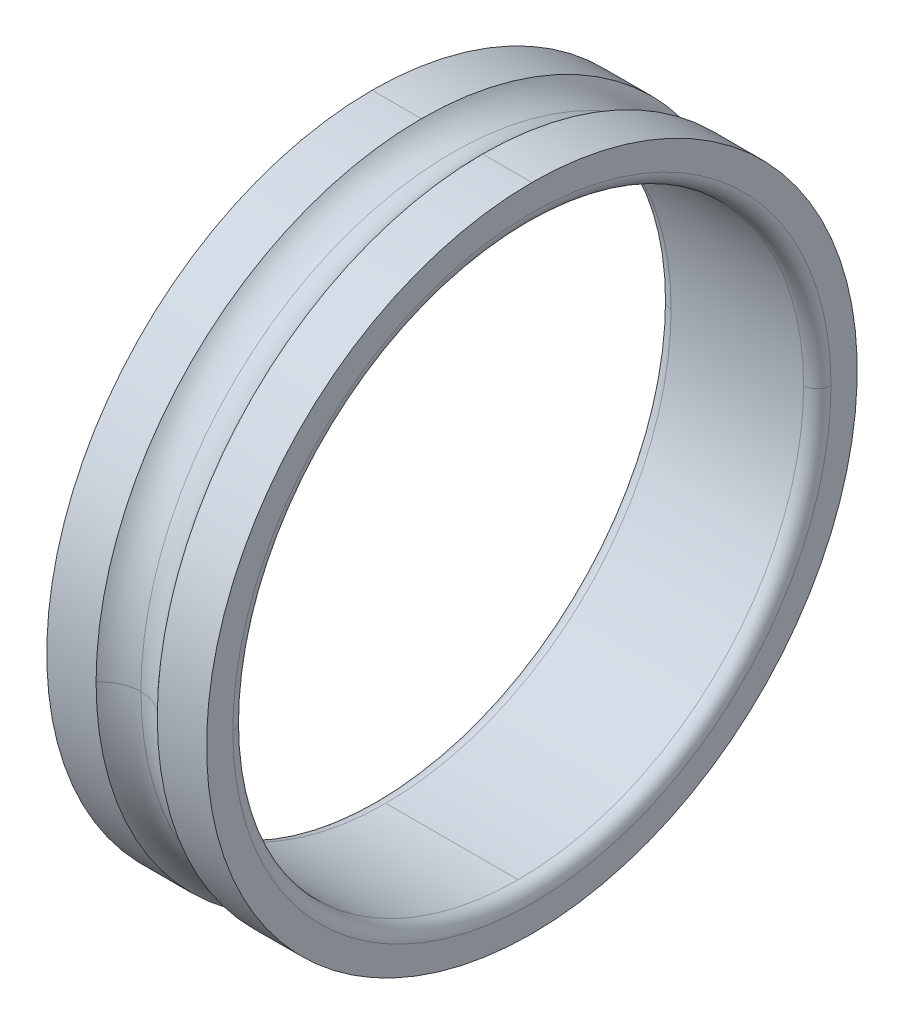
ISO-10303-21;
HEADER;
FILE_DESCRIPTION(('STEP AP214'),'2;1');
FILE_NAME('part.step','',(''),(''),'','','');
FILE_SCHEMA(('AUTOMOTIVE_DESIGN { 1 0 10303 214 1 1 1 1 }'));
ENDSEC;
DATA;
#1=APPLICATION_CONTEXT('core data for automotive mechanical design processes');
#2=APPLICATION_PROTOCOL_DEFINITION('international standard','automotive_design',2000,#1);
#3=PRODUCT_CONTEXT('',#1,'mechanical');
#4=PRODUCT('Part','Part','',(#3));
#5=PRODUCT_RELATED_PRODUCT_CATEGORY('part','',(#4));
#6=PRODUCT_DEFINITION_FORMATION('','',#4);
#7=PRODUCT_DEFINITION_CONTEXT('part definition',#1,'design');
#8=PRODUCT_DEFINITION('design','',#6,#7);
#9=PRODUCT_DEFINITION_SHAPE('','',#8);
#10=(LENGTH_UNIT() NAMED_UNIT(*) SI_UNIT(.MILLI.,.METRE.));
#11=(NAMED_UNIT(*) PLANE_ANGLE_UNIT() SI_UNIT($,.RADIAN.));
#12=(NAMED_UNIT(*) SI_UNIT($,.STERADIAN.) SOLID_ANGLE_UNIT());
#13=UNCERTAINTY_MEASURE_WITH_UNIT(LENGTH_MEASURE(1.E-05),#10,'distance_accuracy_value','');
#14=(GEOMETRIC_REPRESENTATION_CONTEXT(3) GLOBAL_UNCERTAINTY_ASSIGNED_CONTEXT((#13)) GLOBAL_UNIT_ASSIGNED_CONTEXT((#10,
#11,#12)) REPRESENTATION_CONTEXT('',''));
#15=CARTESIAN_POINT('',(0.,0.,0.));
#16=DIRECTION('',(0.,0.,1.));
#17=DIRECTION('',(1.,0.,0.));
#18=AXIS2_PLACEMENT_3D('',#15,#16,#17);
#19=CARTESIAN_POINT('',(5.92023783092273,0.,0.));
#20=DIRECTION('',(1.,0.,0.));
#21=DIRECTION('',(0.,1.,0.));
#22=AXIS2_PLACEMENT_3D('',#19,#20,#21);
#23=CYLINDRICAL_SURFACE('',#22,14.25);
#24=DIRECTION('',(1.,0.,0.));
#25=VECTOR('',#24,1.);
#26=CARTESIAN_POINT('',(5.92023783092273,14.25,0.));
#27=LINE('',#26,#25);
#28=CARTESIAN_POINT('',(4.84047566184545,14.25,0.));
#29=VERTEX_POINT('',#28);
#30=CARTESIAN_POINT('',(7.,14.25,0.));
#31=VERTEX_POINT('',#30);
#32=EDGE_CURVE('E155',#29,#31,#27,.T.);
#33=ORIENTED_EDGE('',*,*,#32,.T.);
#34=CARTESIAN_POINT('',(7.,0.,0.));
#35=DIRECTION('',(1.,0.,0.));
#36=DIRECTION('',(0.,1.,0.));
#37=AXIS2_PLACEMENT_3D('',#34,#35,#36);
#38=CIRCLE('',#37,14.25);
#39=CARTESIAN_POINT('',(7.,-14.25,0.));
#40=VERTEX_POINT('',#39);
#41=EDGE_CURVE('E214',#40,#31,#38,.T.);
#42=ORIENTED_EDGE('',*,*,#41,.F.);
#43=DIRECTION('',(-1.,0.,0.));
#44=VECTOR('',#43,1.);
#45=CARTESIAN_POINT('',(5.92023783092273,-14.25,0.));
#46=LINE('',#45,#44);
#47=CARTESIAN_POINT('',(4.84047566184545,-14.25,0.));
#48=VERTEX_POINT('',#47);
#49=EDGE_CURVE('E161',#40,#48,#46,.T.);
#50=ORIENTED_EDGE('',*,*,#49,.T.);
#51=CARTESIAN_POINT('',(4.84047566184545,0.,0.));
#52=DIRECTION('',(1.,0.,0.));
#53=DIRECTION('',(0.,1.,0.));
#54=AXIS2_PLACEMENT_3D('',#51,#52,#53);
#55=CIRCLE('',#54,14.25);
#56=CARTESIAN_POINT('',(4.84047566184545,0.,-14.25));
#57=VERTEX_POINT('',#56);
#58=EDGE_CURVE('E146',#48,#57,#55,.T.);
#59=ORIENTED_EDGE('',*,*,#58,.T.);
#60=CARTESIAN_POINT('',(4.84047566184545,0.,0.));
#61=DIRECTION('',(1.,0.,0.));
#62=DIRECTION('',(0.,1.,0.));
#63=AXIS2_PLACEMENT_3D('',#60,#61,#62);
#64=CIRCLE('',#63,14.25);
#65=EDGE_CURVE('E152',#57,#29,#64,.T.);
#66=ORIENTED_EDGE('',*,*,#65,.T.);
#67=EDGE_LOOP('',(#33,#42,#50,#59,#66));
#68=FACE_BOUND('',#67,.T.);
#69=ADVANCED_FACE('F17',(#68),#23,.T.);
#70=CARTESIAN_POINT('',(3.5,0.,0.));
#71=DIRECTION('',(1.,0.,0.));
#72=DIRECTION('',(0.,0.,-1.));
#73=AXIS2_PLACEMENT_3D('',#70,#71,#72);
#74=TOROIDAL_SURFACE('',#73,15.375,1.75);
#75=CARTESIAN_POINT('',(3.5,0.,0.));
#76=DIRECTION('',(-1.,0.,0.));
#77=DIRECTION('',(0.,0.,1.));
#78=AXIS2_PLACEMENT_3D('',#75,#76,#77);
#79=CIRCLE('',#78,13.625);
#80=CARTESIAN_POINT('',(3.5,0.,13.625));
#81=VERTEX_POINT('',#80);
#82=CARTESIAN_POINT('',(3.5,0.,-13.625));
#83=VERTEX_POINT('',#82);
#84=EDGE_CURVE('E139',#81,#83,#79,.T.);
#85=ORIENTED_EDGE('',*,*,#84,.T.);
#86=CARTESIAN_POINT('',(3.5,0.,-15.375));
#87=DIRECTION('',(0.,-1.,0.));
#88=DIRECTION('',(0.,0.,-1.));
#89=AXIS2_PLACEMENT_3D('',#86,#87,#88);
#90=CIRCLE('',#89,1.75);
#91=CARTESIAN_POINT('',(2.15952433815455,0.,-14.25));
#92=VERTEX_POINT('',#91);
#93=EDGE_CURVE('E128',#83,#92,#90,.T.);
#94=ORIENTED_EDGE('',*,*,#93,.T.);
#95=CARTESIAN_POINT('',(2.15952433815455,0.,0.));
#96=DIRECTION('',(1.,0.,0.));
#97=DIRECTION('',(0.,1.,0.));
#98=AXIS2_PLACEMENT_3D('',#95,#96,#97);
#99=CIRCLE('',#98,14.25);
#100=CARTESIAN_POINT('',(2.15952433815455,14.25,0.));
#101=VERTEX_POINT('',#100);
#102=EDGE_CURVE('E11',#92,#101,#99,.T.);
#103=ORIENTED_EDGE('',*,*,#102,.T.);
#104=CARTESIAN_POINT('',(2.15952433815455,0.,0.));
#105=DIRECTION('',(1.,0.,0.));
#106=DIRECTION('',(0.,1.,0.));
#107=AXIS2_PLACEMENT_3D('',#104,#105,#106);
#108=CIRCLE('',#107,14.25);
#109=CARTESIAN_POINT('',(2.15952433815455,0.,14.25));
#110=VERTEX_POINT('',#109);
#111=EDGE_CURVE('E127',#101,#110,#108,.T.);
#112=ORIENTED_EDGE('',*,*,#111,.T.);
#113=CARTESIAN_POINT('',(3.5,0.,15.375));
#114=DIRECTION('',(0.,-1.,0.));
#115=DIRECTION('',(0.,0.,1.));
#116=AXIS2_PLACEMENT_3D('',#113,#114,#115);
#117=CIRCLE('',#116,1.75);
#118=EDGE_CURVE('E170',#110,#81,#117,.T.);
#119=ORIENTED_EDGE('',*,*,#118,.T.);
#120=EDGE_LOOP('',(#85,#94,#103,#112,#119));
#121=FACE_BOUND('',#120,.T.);
#122=ADVANCED_FACE('F260',(#121),#74,.F.);
#123=CARTESIAN_POINT('',(1.07976216907727,0.,0.));
#124=DIRECTION('',(1.,0.,0.));
#125=DIRECTION('',(0.,1.,0.));
#126=AXIS2_PLACEMENT_3D('',#123,#124,#125);
#127=CYLINDRICAL_SURFACE('',#126,14.25);
#128=DIRECTION('',(1.,0.,0.));
#129=VECTOR('',#128,1.);
#130=CARTESIAN_POINT('',(1.07976216907727,14.25,0.));
#131=LINE('',#130,#129);
#132=CARTESIAN_POINT('',(0.,14.25,0.));
#133=VERTEX_POINT('',#132);
#134=EDGE_CURVE('E113',#133,#101,#131,.T.);
#135=ORIENTED_EDGE('',*,*,#134,.T.);
#136=ORIENTED_EDGE('',*,*,#102,.F.);
#137=CARTESIAN_POINT('',(2.15952433815455,0.,0.));
#138=DIRECTION('',(1.,0.,0.));
#139=DIRECTION('',(0.,1.,0.));
#140=AXIS2_PLACEMENT_3D('',#137,#138,#139);
#141=CIRCLE('',#140,14.25);
#142=CARTESIAN_POINT('',(2.15952433815455,-14.25,0.));
#143=VERTEX_POINT('',#142);
#144=EDGE_CURVE('E131',#143,#92,#141,.T.);
#145=ORIENTED_EDGE('',*,*,#144,.F.);
#146=DIRECTION('',(-1.,0.,0.));
#147=VECTOR('',#146,1.);
#148=CARTESIAN_POINT('',(1.07976216907727,-14.25,0.));
#149=LINE('',#148,#147);
#150=CARTESIAN_POINT('',(0.,-14.25,0.));
#151=VERTEX_POINT('',#150);
#152=EDGE_CURVE('E115',#143,#151,#149,.T.);
#153=ORIENTED_EDGE('',*,*,#152,.T.);
#154=CARTESIAN_POINT('',(0.,0.,0.));
#155=DIRECTION('',(1.,0.,0.));
#156=DIRECTION('',(0.,1.,0.));
#157=AXIS2_PLACEMENT_3D('',#154,#155,#156);
#158=CIRCLE('',#157,14.25);
#159=EDGE_CURVE('E24',#151,#133,#158,.T.);
#160=ORIENTED_EDGE('',*,*,#159,.T.);
#161=EDGE_LOOP('',(#135,#136,#145,#153,#160));
#162=FACE_BOUND('',#161,.T.);
#163=ADVANCED_FACE('F111',(#162),#127,.T.);
#164=CARTESIAN_POINT('',(0.,13.675,0.));
#165=DIRECTION('',(-1.,0.,0.));
#166=DIRECTION('',(0.,0.,1.));
#167=AXIS2_PLACEMENT_3D('',#164,#165,#166);
#168=PLANE('',#167);
#169=CARTESIAN_POINT('',(0.,0.,0.));
#170=DIRECTION('',(1.,0.,0.));
#171=DIRECTION('',(0.,1.,0.));
#172=AXIS2_PLACEMENT_3D('',#169,#170,#171);
#173=CIRCLE('',#172,13.1);
#174=CARTESIAN_POINT('',(0.,0.,13.1));
#175=VERTEX_POINT('',#174);
#176=CARTESIAN_POINT('',(0.,0.,-13.1));
#177=VERTEX_POINT('',#176);
#178=EDGE_CURVE('E118',#175,#177,#173,.T.);
#179=ORIENTED_EDGE('',*,*,#178,.T.);
#180=CARTESIAN_POINT('',(0.,0.,0.));
#181=DIRECTION('',(1.,0.,0.));
#182=DIRECTION('',(0.,1.,0.));
#183=AXIS2_PLACEMENT_3D('',#180,#181,#182);
#184=CIRCLE('',#183,13.1);
#185=EDGE_CURVE('E191',#177,#175,#184,.T.);
#186=ORIENTED_EDGE('',*,*,#185,.T.);
#187=EDGE_LOOP('',(#179,#186));
#188=FACE_BOUND('',#187,.T.);
#189=CARTESIAN_POINT('',(0.,0.,0.));
#190=DIRECTION('',(1.,0.,0.));
#191=DIRECTION('',(0.,1.,0.));
#192=AXIS2_PLACEMENT_3D('',#189,#190,#191);
#193=CIRCLE('',#192,14.25);
#194=EDGE_CURVE('E120',#133,#151,#193,.T.);
#195=ORIENTED_EDGE('',*,*,#194,.F.);
#196=ORIENTED_EDGE('',*,*,#159,.F.);
#197=EDGE_LOOP('',(#195,#196));
#198=FACE_BOUND('',#197,.T.);
#199=ADVANCED_FACE('F121',(#188,#198),#168,.T.);
#200=CARTESIAN_POINT('',(0.6,0.,0.));
#201=DIRECTION('',(1.,0.,0.));
#202=DIRECTION('',(0.,0.,-1.));
#203=AXIS2_PLACEMENT_3D('',#200,#201,#202);
#204=TOROIDAL_SURFACE('',#203,13.1,0.6);
#205=CARTESIAN_POINT('',(0.6,0.,-13.1));
#206=DIRECTION('',(0.,-1.,0.));
#207=DIRECTION('',(0.,0.,-1.));
#208=AXIS2_PLACEMENT_3D('',#205,#206,#207);
#209=CIRCLE('',#208,0.6);
#210=CARTESIAN_POINT('',(0.6,0.,-12.5));
#211=VERTEX_POINT('',#210);
#212=EDGE_CURVE('E179',#211,#177,#209,.T.);
#213=ORIENTED_EDGE('',*,*,#212,.T.);
#214=ORIENTED_EDGE('',*,*,#178,.F.);
#215=CARTESIAN_POINT('',(0.6,0.,13.1));
#216=DIRECTION('',(0.,-1.,0.));
#217=DIRECTION('',(0.,0.,1.));
#218=AXIS2_PLACEMENT_3D('',#215,#216,#217);
#219=CIRCLE('',#218,0.6);
#220=CARTESIAN_POINT('',(0.6,0.,12.5));
#221=VERTEX_POINT('',#220);
#222=EDGE_CURVE('E188',#175,#221,#219,.T.);
#223=ORIENTED_EDGE('',*,*,#222,.T.);
#224=CARTESIAN_POINT('',(0.6,0.,0.));
#225=DIRECTION('',(1.,0.,0.));
#226=DIRECTION('',(0.,1.,0.));
#227=AXIS2_PLACEMENT_3D('',#224,#225,#226);
#228=CIRCLE('',#227,12.5);
#229=CARTESIAN_POINT('',(0.6,-12.5,0.));
#230=VERTEX_POINT('',#229);
#231=EDGE_CURVE('E196',#221,#230,#228,.T.);
#232=ORIENTED_EDGE('',*,*,#231,.T.);
#233=CARTESIAN_POINT('',(0.6,0.,0.));
#234=DIRECTION('',(1.,0.,0.));
#235=DIRECTION('',(0.,1.,0.));
#236=AXIS2_PLACEMENT_3D('',#233,#234,#235);
#237=CIRCLE('',#236,12.5);
#238=EDGE_CURVE('E199',#230,#211,#237,.T.);
#239=ORIENTED_EDGE('',*,*,#238,.T.);
#240=EDGE_LOOP('',(#213,#214,#223,#232,#239));
#241=FACE_BOUND('',#240,.T.);
#242=ADVANCED_FACE('F218',(#241),#204,.T.);
#243=CARTESIAN_POINT('',(3.5,0.,0.));
#244=DIRECTION('',(1.,0.,0.));
#245=DIRECTION('',(0.,1.,0.));
#246=AXIS2_PLACEMENT_3D('',#243,#244,#245);
#247=CYLINDRICAL_SURFACE('',#246,12.5);
#248=DIRECTION('',(1.,0.,0.));
#249=VECTOR('',#248,1.);
#250=CARTESIAN_POINT('',(3.5,12.5,0.));
#251=LINE('',#250,#249);
#252=CARTESIAN_POINT('',(0.6,12.5,0.));
#253=VERTEX_POINT('',#252);
#254=CARTESIAN_POINT('',(6.4,12.5,0.));
#255=VERTEX_POINT('',#254);
#256=EDGE_CURVE('E194',#253,#255,#251,.T.);
#257=ORIENTED_EDGE('',*,*,#256,.T.);
#258=CARTESIAN_POINT('',(6.4,0.,0.));
#259=DIRECTION('',(1.,0.,0.));
#260=DIRECTION('',(0.,1.,0.));
#261=AXIS2_PLACEMENT_3D('',#258,#259,#260);
#262=CIRCLE('',#261,12.5);
#263=CARTESIAN_POINT('',(6.4,0.,12.5));
#264=VERTEX_POINT('',#263);
#265=EDGE_CURVE('E212',#255,#264,#262,.T.);
#266=ORIENTED_EDGE('',*,*,#265,.T.);
#267=CARTESIAN_POINT('',(6.4,0.,0.));
#268=DIRECTION('',(1.,0.,0.));
#269=DIRECTION('',(0.,1.,0.));
#270=AXIS2_PLACEMENT_3D('',#267,#268,#269);
#271=CIRCLE('',#270,12.5);
#272=CARTESIAN_POINT('',(6.4,-12.5,0.));
#273=VERTEX_POINT('',#272);
#274=EDGE_CURVE('E31',#264,#273,#271,.T.);
#275=ORIENTED_EDGE('',*,*,#274,.T.);
#276=DIRECTION('',(-1.,0.,0.));
#277=VECTOR('',#276,1.);
#278=CARTESIAN_POINT('',(3.5,-12.5,0.));
#279=LINE('',#278,#277);
#280=EDGE_CURVE('E201',#273,#230,#279,.T.);
#281=ORIENTED_EDGE('',*,*,#280,.T.);
#282=ORIENTED_EDGE('',*,*,#231,.F.);
#283=CARTESIAN_POINT('',(0.6,0.,0.));
#284=DIRECTION('',(1.,0.,0.));
#285=DIRECTION('',(0.,1.,0.));
#286=AXIS2_PLACEMENT_3D('',#283,#284,#285);
#287=CIRCLE('',#286,12.5);
#288=EDGE_CURVE('E185',#253,#221,#287,.T.);
#289=ORIENTED_EDGE('',*,*,#288,.F.);
#290=EDGE_LOOP('',(#257,#266,#275,#281,#282,#289));
#291=FACE_BOUND('',#290,.T.);
#292=ADVANCED_FACE('F225',(#291),#247,.F.);
#293=CARTESIAN_POINT('',(6.4,0.,0.));
#294=DIRECTION('',(1.,0.,0.));
#295=DIRECTION('',(0.,0.,-1.));
#296=AXIS2_PLACEMENT_3D('',#293,#294,#295);
#297=TOROIDAL_SURFACE('',#296,13.1,0.6);
#298=CARTESIAN_POINT('',(6.4,0.,-13.1));
#299=DIRECTION('',(0.,-1.,0.));
#300=DIRECTION('',(0.,0.,-1.));
#301=AXIS2_PLACEMENT_3D('',#298,#299,#300);
#302=CIRCLE('',#301,0.6);
#303=CARTESIAN_POINT('',(7.,0.,-13.1));
#304=VERTEX_POINT('',#303);
#305=CARTESIAN_POINT('',(6.4,0.,-12.5));
#306=VERTEX_POINT('',#305);
#307=EDGE_CURVE('E138',#304,#306,#302,.T.);
#308=ORIENTED_EDGE('',*,*,#307,.T.);
#309=CARTESIAN_POINT('',(6.4,0.,0.));
#310=DIRECTION('',(1.,0.,0.));
#311=DIRECTION('',(0.,1.,0.));
#312=AXIS2_PLACEMENT_3D('',#309,#310,#311);
#313=CIRCLE('',#312,12.5);
#314=EDGE_CURVE('E204',#273,#306,#313,.T.);
#315=ORIENTED_EDGE('',*,*,#314,.F.);
#316=ORIENTED_EDGE('',*,*,#274,.F.);
#317=CARTESIAN_POINT('',(6.4,0.,13.1));
#318=DIRECTION('',(0.,-1.,0.));
#319=DIRECTION('',(0.,0.,1.));
#320=AXIS2_PLACEMENT_3D('',#317,#318,#319);
#321=CIRCLE('',#320,0.6);
#322=CARTESIAN_POINT('',(7.,0.,13.1));
#323=VERTEX_POINT('',#322);
#324=EDGE_CURVE('E137',#264,#323,#321,.T.);
#325=ORIENTED_EDGE('',*,*,#324,.T.);
#326=CARTESIAN_POINT('',(7.,0.,0.));
#327=DIRECTION('',(1.,0.,0.));
#328=DIRECTION('',(0.,1.,0.));
#329=AXIS2_PLACEMENT_3D('',#326,#327,#328);
#330=CIRCLE('',#329,13.1);
#331=EDGE_CURVE('E38',#323,#304,#330,.T.);
#332=ORIENTED_EDGE('',*,*,#331,.T.);
#333=EDGE_LOOP('',(#308,#315,#316,#325,#332));
#334=FACE_BOUND('',#333,.T.);
#335=ADVANCED_FACE('F238',(#334),#297,.T.);
#336=CARTESIAN_POINT('',(7.,13.675,0.));
#337=DIRECTION('',(1.,0.,0.));
#338=DIRECTION('',(0.,1.,0.));
#339=AXIS2_PLACEMENT_3D('',#336,#337,#338);
#340=PLANE('',#339);
#341=CARTESIAN_POINT('',(7.,0.,0.));
#342=DIRECTION('',(1.,0.,0.));
#343=DIRECTION('',(0.,1.,0.));
#344=AXIS2_PLACEMENT_3D('',#341,#342,#343);
#345=CIRCLE('',#344,13.1);
#346=EDGE_CURVE('E134',#304,#323,#345,.T.);
#347=ORIENTED_EDGE('',*,*,#346,.F.);
#348=ORIENTED_EDGE('',*,*,#331,.F.);
#349=EDGE_LOOP('',(#347,#348));
#350=FACE_BOUND('',#349,.T.);
#351=CARTESIAN_POINT('',(7.,0.,0.));
#352=DIRECTION('',(1.,0.,0.));
#353=DIRECTION('',(0.,1.,0.));
#354=AXIS2_PLACEMENT_3D('',#351,#352,#353);
#355=CIRCLE('',#354,14.25);
#356=EDGE_CURVE('E163',#31,#40,#355,.T.);
#357=ORIENTED_EDGE('',*,*,#356,.T.);
#358=ORIENTED_EDGE('',*,*,#41,.T.);
#359=EDGE_LOOP('',(#357,#358));
#360=FACE_BOUND('',#359,.T.);
#361=ADVANCED_FACE('F239',(#350,#360),#340,.T.);
#362=CARTESIAN_POINT('',(6.4,0.,0.));
#363=DIRECTION('',(1.,0.,0.));
#364=DIRECTION('',(0.,0.,-1.));
#365=AXIS2_PLACEMENT_3D('',#362,#363,#364);
#366=TOROIDAL_SURFACE('',#365,13.1,0.6);
#367=ORIENTED_EDGE('',*,*,#307,.F.);
#368=ORIENTED_EDGE('',*,*,#346,.T.);
#369=ORIENTED_EDGE('',*,*,#324,.F.);
#370=ORIENTED_EDGE('',*,*,#265,.F.);
#371=CARTESIAN_POINT('',(6.4,0.,0.));
#372=DIRECTION('',(1.,0.,0.));
#373=DIRECTION('',(0.,1.,0.));
#374=AXIS2_PLACEMENT_3D('',#371,#372,#373);
#375=CIRCLE('',#374,12.5);
#376=EDGE_CURVE('E207',#306,#255,#375,.T.);
#377=ORIENTED_EDGE('',*,*,#376,.F.);
#378=EDGE_LOOP('',(#367,#368,#369,#370,#377));
#379=FACE_BOUND('',#378,.T.);
#380=ADVANCED_FACE('F237',(#379),#366,.T.);
#381=CARTESIAN_POINT('',(3.5,0.,0.));
#382=DIRECTION('',(1.,0.,0.));
#383=DIRECTION('',(0.,1.,0.));
#384=AXIS2_PLACEMENT_3D('',#381,#382,#383);
#385=CYLINDRICAL_SURFACE('',#384,12.5);
#386=ORIENTED_EDGE('',*,*,#256,.F.);
#387=CARTESIAN_POINT('',(0.6,0.,0.));
#388=DIRECTION('',(1.,0.,0.));
#389=DIRECTION('',(0.,1.,0.));
#390=AXIS2_PLACEMENT_3D('',#387,#388,#389);
#391=CIRCLE('',#390,12.5);
#392=EDGE_CURVE('E182',#211,#253,#391,.T.);
#393=ORIENTED_EDGE('',*,*,#392,.F.);
#394=ORIENTED_EDGE('',*,*,#238,.F.);
#395=ORIENTED_EDGE('',*,*,#280,.F.);
#396=ORIENTED_EDGE('',*,*,#314,.T.);
#397=ORIENTED_EDGE('',*,*,#376,.T.);
#398=EDGE_LOOP('',(#386,#393,#394,#395,#396,#397));
#399=FACE_BOUND('',#398,.T.);
#400=ADVANCED_FACE('F227',(#399),#385,.F.);
#401=CARTESIAN_POINT('',(0.6,0.,0.));
#402=DIRECTION('',(1.,0.,0.));
#403=DIRECTION('',(0.,0.,-1.));
#404=AXIS2_PLACEMENT_3D('',#401,#402,#403);
#405=TOROIDAL_SURFACE('',#404,13.1,0.6);
#406=ORIENTED_EDGE('',*,*,#212,.F.);
#407=ORIENTED_EDGE('',*,*,#392,.T.);
#408=ORIENTED_EDGE('',*,*,#288,.T.);
#409=ORIENTED_EDGE('',*,*,#222,.F.);
#410=ORIENTED_EDGE('',*,*,#185,.F.);
#411=EDGE_LOOP('',(#406,#407,#408,#409,#410));
#412=FACE_BOUND('',#411,.T.);
#413=ADVANCED_FACE('F231',(#412),#405,.T.);
#414=CARTESIAN_POINT('',(1.07976216907727,0.,0.));
#415=DIRECTION('',(1.,0.,0.));
#416=DIRECTION('',(0.,1.,0.));
#417=AXIS2_PLACEMENT_3D('',#414,#415,#416);
#418=CYLINDRICAL_SURFACE('',#417,14.25);
#419=ORIENTED_EDGE('',*,*,#134,.F.);
#420=ORIENTED_EDGE('',*,*,#194,.T.);
#421=ORIENTED_EDGE('',*,*,#152,.F.);
#422=CARTESIAN_POINT('',(2.15952433815455,0.,0.));
#423=DIRECTION('',(1.,0.,0.));
#424=DIRECTION('',(0.,1.,0.));
#425=AXIS2_PLACEMENT_3D('',#422,#423,#424);
#426=CIRCLE('',#425,14.25);
#427=EDGE_CURVE('E172',#110,#143,#426,.T.);
#428=ORIENTED_EDGE('',*,*,#427,.F.);
#429=ORIENTED_EDGE('',*,*,#111,.F.);
#430=EDGE_LOOP('',(#419,#420,#421,#428,#429));
#431=FACE_BOUND('',#430,.T.);
#432=ADVANCED_FACE('F125',(#431),#418,.T.);
#433=CARTESIAN_POINT('',(3.5,0.,0.));
#434=DIRECTION('',(1.,0.,0.));
#435=DIRECTION('',(0.,0.,-1.));
#436=AXIS2_PLACEMENT_3D('',#433,#434,#435);
#437=TOROIDAL_SURFACE('',#436,15.375,1.75);
#438=CARTESIAN_POINT('',(3.5,0.,0.));
#439=DIRECTION('',(-1.,0.,0.));
#440=DIRECTION('',(0.,0.,1.));
#441=AXIS2_PLACEMENT_3D('',#438,#439,#440);
#442=CIRCLE('',#441,13.625);
#443=EDGE_CURVE('E149',#83,#81,#442,.T.);
#444=ORIENTED_EDGE('',*,*,#443,.T.);
#445=ORIENTED_EDGE('',*,*,#118,.F.);
#446=ORIENTED_EDGE('',*,*,#427,.T.);
#447=ORIENTED_EDGE('',*,*,#144,.T.);
#448=ORIENTED_EDGE('',*,*,#93,.F.);
#449=EDGE_LOOP('',(#444,#445,#446,#447,#448));
#450=FACE_BOUND('',#449,.T.);
#451=ADVANCED_FACE('F263',(#450),#437,.F.);
#452=CARTESIAN_POINT('',(5.92023783092273,0.,0.));
#453=DIRECTION('',(1.,0.,0.));
#454=DIRECTION('',(0.,1.,0.));
#455=AXIS2_PLACEMENT_3D('',#452,#453,#454);
#456=CYLINDRICAL_SURFACE('',#455,14.25);
#457=ORIENTED_EDGE('',*,*,#32,.F.);
#458=CARTESIAN_POINT('',(4.84047566184545,0.,0.));
#459=DIRECTION('',(1.,0.,0.));
#460=DIRECTION('',(0.,1.,0.));
#461=AXIS2_PLACEMENT_3D('',#458,#459,#460);
#462=CIRCLE('',#461,14.25);
#463=CARTESIAN_POINT('',(4.84047566184545,0.,14.25));
#464=VERTEX_POINT('',#463);
#465=EDGE_CURVE('E145',#29,#464,#462,.T.);
#466=ORIENTED_EDGE('',*,*,#465,.T.);
#467=CARTESIAN_POINT('',(4.84047566184545,0.,0.));
#468=DIRECTION('',(1.,0.,0.));
#469=DIRECTION('',(0.,1.,0.));
#470=AXIS2_PLACEMENT_3D('',#467,#468,#469);
#471=CIRCLE('',#470,14.25);
#472=EDGE_CURVE('E148',#464,#48,#471,.T.);
#473=ORIENTED_EDGE('',*,*,#472,.T.);
#474=ORIENTED_EDGE('',*,*,#49,.F.);
#475=ORIENTED_EDGE('',*,*,#356,.F.);
#476=EDGE_LOOP('',(#457,#466,#473,#474,#475));
#477=FACE_BOUND('',#476,.T.);
#478=ADVANCED_FACE('F246',(#477),#456,.T.);
#479=CARTESIAN_POINT('',(3.5,0.,0.));
#480=DIRECTION('',(1.,0.,0.));
#481=DIRECTION('',(0.,0.,-1.));
#482=AXIS2_PLACEMENT_3D('',#479,#480,#481);
#483=TOROIDAL_SURFACE('',#482,15.375,1.75);
#484=ORIENTED_EDGE('',*,*,#443,.F.);
#485=CARTESIAN_POINT('',(3.5,0.,-15.375));
#486=DIRECTION('',(0.,-1.,0.));
#487=DIRECTION('',(0.,0.,-1.));
#488=AXIS2_PLACEMENT_3D('',#485,#486,#487);
#489=CIRCLE('',#488,1.75);
#490=EDGE_CURVE('E158',#57,#83,#489,.T.);
#491=ORIENTED_EDGE('',*,*,#490,.F.);
#492=ORIENTED_EDGE('',*,*,#58,.F.);
#493=ORIENTED_EDGE('',*,*,#472,.F.);
#494=CARTESIAN_POINT('',(3.5,0.,15.375));
#495=DIRECTION('',(0.,-1.,0.));
#496=DIRECTION('',(0.,0.,1.));
#497=AXIS2_PLACEMENT_3D('',#494,#495,#496);
#498=CIRCLE('',#497,1.75);
#499=EDGE_CURVE('E142',#81,#464,#498,.T.);
#500=ORIENTED_EDGE('',*,*,#499,.F.);
#501=EDGE_LOOP('',(#484,#491,#492,#493,#500));
#502=FACE_BOUND('',#501,.T.);
#503=ADVANCED_FACE('F258',(#502),#483,.F.);
#504=CARTESIAN_POINT('',(3.5,0.,0.));
#505=DIRECTION('',(1.,0.,0.));
#506=DIRECTION('',(0.,0.,-1.));
#507=AXIS2_PLACEMENT_3D('',#504,#505,#506);
#508=TOROIDAL_SURFACE('',#507,15.375,1.75);
#509=ORIENTED_EDGE('',*,*,#84,.F.);
#510=ORIENTED_EDGE('',*,*,#499,.T.);
#511=ORIENTED_EDGE('',*,*,#465,.F.);
#512=ORIENTED_EDGE('',*,*,#65,.F.);
#513=ORIENTED_EDGE('',*,*,#490,.T.);
#514=EDGE_LOOP('',(#509,#510,#511,#512,#513));
#515=FACE_BOUND('',#514,.T.);
#516=ADVANCED_FACE('F255',(#515),#508,.F.);
#517=CLOSED_SHELL('',(#69,#122,#163,#199,#242,#292,#335,#361,#380,#400,#413,#432,#451,#478,#503,#516));
#518=MANIFOLD_SOLID_BREP('B1',#517);
#519=ADVANCED_BREP_SHAPE_REPRESENTATION('',(#18,#518),#14);
#520=SHAPE_DEFINITION_REPRESENTATION(#9,#519);
ENDSEC;
END-ISO-10303-21;
